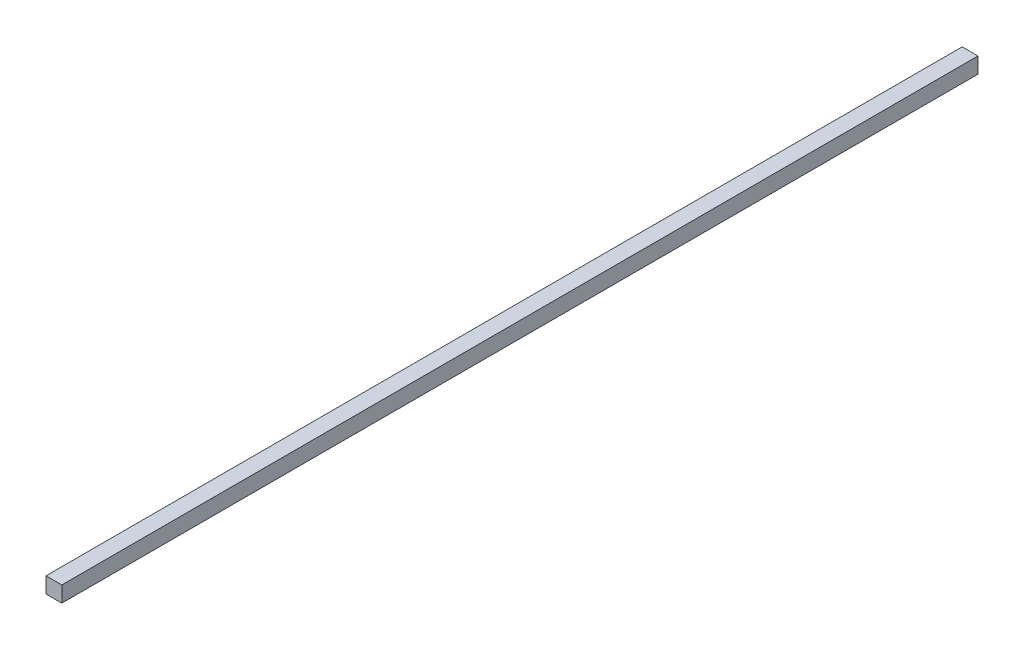
ISO-10303-21;
HEADER;
FILE_DESCRIPTION(('STEP AP214'),'2;1');
FILE_NAME('part.step','',(''),(''),'','','');
FILE_SCHEMA(('AUTOMOTIVE_DESIGN { 1 0 10303 214 1 1 1 1 }'));
ENDSEC;
DATA;
#1=APPLICATION_CONTEXT('core data for automotive mechanical design processes');
#2=APPLICATION_PROTOCOL_DEFINITION('international standard','automotive_design',2000,#1);
#3=PRODUCT_CONTEXT('',#1,'mechanical');
#4=PRODUCT('Part','Part','',(#3));
#5=PRODUCT_RELATED_PRODUCT_CATEGORY('part','',(#4));
#6=PRODUCT_DEFINITION_FORMATION('','',#4);
#7=PRODUCT_DEFINITION_CONTEXT('part definition',#1,'design');
#8=PRODUCT_DEFINITION('design','',#6,#7);
#9=PRODUCT_DEFINITION_SHAPE('','',#8);
#10=(LENGTH_UNIT() NAMED_UNIT(*) SI_UNIT(.MILLI.,.METRE.));
#11=(NAMED_UNIT(*) PLANE_ANGLE_UNIT() SI_UNIT($,.RADIAN.));
#12=(NAMED_UNIT(*) SI_UNIT($,.STERADIAN.) SOLID_ANGLE_UNIT());
#13=UNCERTAINTY_MEASURE_WITH_UNIT(LENGTH_MEASURE(1.E-05),#10,'distance_accuracy_value','');
#14=(GEOMETRIC_REPRESENTATION_CONTEXT(3) GLOBAL_UNCERTAINTY_ASSIGNED_CONTEXT((#13)) GLOBAL_UNIT_ASSIGNED_CONTEXT((#10,
#11,#12)) REPRESENTATION_CONTEXT('',''));
#15=CARTESIAN_POINT('',(0.,0.,0.));
#16=DIRECTION('',(0.,0.,1.));
#17=DIRECTION('',(1.,0.,0.));
#18=AXIS2_PLACEMENT_3D('',#15,#16,#17);
#19=CARTESIAN_POINT('',(20.,-20.,2320.));
#20=DIRECTION('',(-1.,0.,0.));
#21=DIRECTION('',(0.,0.,1.));
#22=AXIS2_PLACEMENT_3D('',#19,#20,#21);
#23=PLANE('',#22);
#24=DIRECTION('',(0.,1.,0.));
#25=VECTOR('',#24,1.);
#26=CARTESIAN_POINT('',(20.,-20.,0.));
#27=LINE('',#26,#25);
#28=CARTESIAN_POINT('',(20.,-20.,0.));
#29=VERTEX_POINT('',#28);
#30=CARTESIAN_POINT('',(20.,20.,0.));
#31=VERTEX_POINT('',#30);
#32=EDGE_CURVE('E101',#29,#31,#27,.T.);
#33=ORIENTED_EDGE('',*,*,#32,.T.);
#34=DIRECTION('',(0.,0.,-1.));
#35=VECTOR('',#34,1.);
#36=CARTESIAN_POINT('',(20.,20.,2320.));
#37=LINE('',#36,#35);
#38=CARTESIAN_POINT('',(20.,20.,2320.));
#39=VERTEX_POINT('',#38);
#40=EDGE_CURVE('E11',#39,#31,#37,.T.);
#41=ORIENTED_EDGE('',*,*,#40,.F.);
#42=DIRECTION('',(0.,1.,0.));
#43=VECTOR('',#42,1.);
#44=CARTESIAN_POINT('',(20.,-20.,2320.));
#45=LINE('',#44,#43);
#46=CARTESIAN_POINT('',(20.,-20.,2320.));
#47=VERTEX_POINT('',#46);
#48=EDGE_CURVE('E89',#47,#39,#45,.T.);
#49=ORIENTED_EDGE('',*,*,#48,.F.);
#50=DIRECTION('',(0.,0.,-1.));
#51=VECTOR('',#50,1.);
#52=CARTESIAN_POINT('',(20.,-20.,2320.));
#53=LINE('',#52,#51);
#54=EDGE_CURVE('E97',#47,#29,#53,.T.);
#55=ORIENTED_EDGE('',*,*,#54,.T.);
#56=EDGE_LOOP('',(#33,#41,#49,#55));
#57=FACE_BOUND('',#56,.T.);
#58=ADVANCED_FACE('F38',(#57),#23,.F.);
#59=CARTESIAN_POINT('',(-20.,20.,2320.));
#60=DIRECTION('',(0.,-1.,0.));
#61=DIRECTION('',(0.,0.,-1.));
#62=AXIS2_PLACEMENT_3D('',#59,#60,#61);
#63=PLANE('',#62);
#64=DIRECTION('',(-1.,0.,0.));
#65=VECTOR('',#64,1.);
#66=CARTESIAN_POINT('',(-20.,20.,0.));
#67=LINE('',#66,#65);
#68=CARTESIAN_POINT('',(-20.,20.,0.));
#69=VERTEX_POINT('',#68);
#70=EDGE_CURVE('E93',#31,#69,#67,.T.);
#71=ORIENTED_EDGE('',*,*,#70,.T.);
#72=DIRECTION('',(0.,0.,-1.));
#73=VECTOR('',#72,1.);
#74=CARTESIAN_POINT('',(-20.,20.,2320.));
#75=LINE('',#74,#73);
#76=CARTESIAN_POINT('',(-20.,20.,2320.));
#77=VERTEX_POINT('',#76);
#78=EDGE_CURVE('E46',#77,#69,#75,.T.);
#79=ORIENTED_EDGE('',*,*,#78,.F.);
#80=DIRECTION('',(-1.,0.,0.));
#81=VECTOR('',#80,1.);
#82=CARTESIAN_POINT('',(-20.,20.,2320.));
#83=LINE('',#82,#81);
#84=EDGE_CURVE('E84',#39,#77,#83,.T.);
#85=ORIENTED_EDGE('',*,*,#84,.F.);
#86=ORIENTED_EDGE('',*,*,#40,.T.);
#87=EDGE_LOOP('',(#71,#79,#85,#86));
#88=FACE_BOUND('',#87,.T.);
#89=ADVANCED_FACE('F92',(#88),#63,.F.);
#90=CARTESIAN_POINT('',(-20.,-20.,2320.));
#91=DIRECTION('',(1.,0.,0.));
#92=DIRECTION('',(0.,0.,-1.));
#93=AXIS2_PLACEMENT_3D('',#90,#91,#92);
#94=PLANE('',#93);
#95=DIRECTION('',(0.,-1.,0.));
#96=VECTOR('',#95,1.);
#97=CARTESIAN_POINT('',(-20.,-20.,0.));
#98=LINE('',#97,#96);
#99=CARTESIAN_POINT('',(-20.,-20.,0.));
#100=VERTEX_POINT('',#99);
#101=EDGE_CURVE('E71',#69,#100,#98,.T.);
#102=ORIENTED_EDGE('',*,*,#101,.T.);
#103=DIRECTION('',(0.,0.,-1.));
#104=VECTOR('',#103,1.);
#105=CARTESIAN_POINT('',(-20.,-20.,2320.));
#106=LINE('',#105,#104);
#107=CARTESIAN_POINT('',(-20.,-20.,2320.));
#108=VERTEX_POINT('',#107);
#109=EDGE_CURVE('E94',#108,#100,#106,.T.);
#110=ORIENTED_EDGE('',*,*,#109,.F.);
#111=DIRECTION('',(0.,-1.,0.));
#112=VECTOR('',#111,1.);
#113=CARTESIAN_POINT('',(-20.,-20.,2320.));
#114=LINE('',#113,#112);
#115=EDGE_CURVE('E87',#77,#108,#114,.T.);
#116=ORIENTED_EDGE('',*,*,#115,.F.);
#117=ORIENTED_EDGE('',*,*,#78,.T.);
#118=EDGE_LOOP('',(#102,#110,#116,#117));
#119=FACE_BOUND('',#118,.T.);
#120=ADVANCED_FACE('F95',(#119),#94,.F.);
#121=CARTESIAN_POINT('',(-20.,-20.,2320.));
#122=DIRECTION('',(0.,1.,0.));
#123=DIRECTION('',(0.,0.,1.));
#124=AXIS2_PLACEMENT_3D('',#121,#122,#123);
#125=PLANE('',#124);
#126=DIRECTION('',(1.,0.,0.));
#127=VECTOR('',#126,1.);
#128=CARTESIAN_POINT('',(-20.,-20.,0.));
#129=LINE('',#128,#127);
#130=EDGE_CURVE('E77',#100,#29,#129,.T.);
#131=ORIENTED_EDGE('',*,*,#130,.T.);
#132=ORIENTED_EDGE('',*,*,#54,.F.);
#133=DIRECTION('',(1.,0.,0.));
#134=VECTOR('',#133,1.);
#135=CARTESIAN_POINT('',(-20.,-20.,2320.));
#136=LINE('',#135,#134);
#137=EDGE_CURVE('E54',#108,#47,#136,.T.);
#138=ORIENTED_EDGE('',*,*,#137,.F.);
#139=ORIENTED_EDGE('',*,*,#109,.T.);
#140=EDGE_LOOP('',(#131,#132,#138,#139));
#141=FACE_BOUND('',#140,.T.);
#142=ADVANCED_FACE('F108',(#141),#125,.F.);
#143=CARTESIAN_POINT('',(0.,0.,2320.));
#144=DIRECTION('',(0.,0.,-1.));
#145=DIRECTION('',(-1.,0.,0.));
#146=AXIS2_PLACEMENT_3D('',#143,#144,#145);
#147=PLANE('',#146);
#148=ORIENTED_EDGE('',*,*,#48,.T.);
#149=ORIENTED_EDGE('',*,*,#84,.T.);
#150=ORIENTED_EDGE('',*,*,#115,.T.);
#151=ORIENTED_EDGE('',*,*,#137,.T.);
#152=EDGE_LOOP('',(#148,#149,#150,#151));
#153=FACE_BOUND('',#152,.T.);
#154=ADVANCED_FACE('F85',(#153),#147,.F.);
#155=CARTESIAN_POINT('',(0.,0.,0.));
#156=DIRECTION('',(0.,0.,-1.));
#157=DIRECTION('',(-1.,0.,0.));
#158=AXIS2_PLACEMENT_3D('',#155,#156,#157);
#159=PLANE('',#158);
#160=ORIENTED_EDGE('',*,*,#32,.F.);
#161=ORIENTED_EDGE('',*,*,#130,.F.);
#162=ORIENTED_EDGE('',*,*,#101,.F.);
#163=ORIENTED_EDGE('',*,*,#70,.F.);
#164=EDGE_LOOP('',(#160,#161,#162,#163));
#165=FACE_BOUND('',#164,.T.);
#166=ADVANCED_FACE('F111',(#165),#159,.T.);
#167=CLOSED_SHELL('',(#58,#89,#120,#142,#154,#166));
#168=MANIFOLD_SOLID_BREP('B2',#167);
#169=ADVANCED_BREP_SHAPE_REPRESENTATION('',(#18,#168),#14);
#170=SHAPE_DEFINITION_REPRESENTATION(#9,#169);
ENDSEC;
END-ISO-10303-21;
